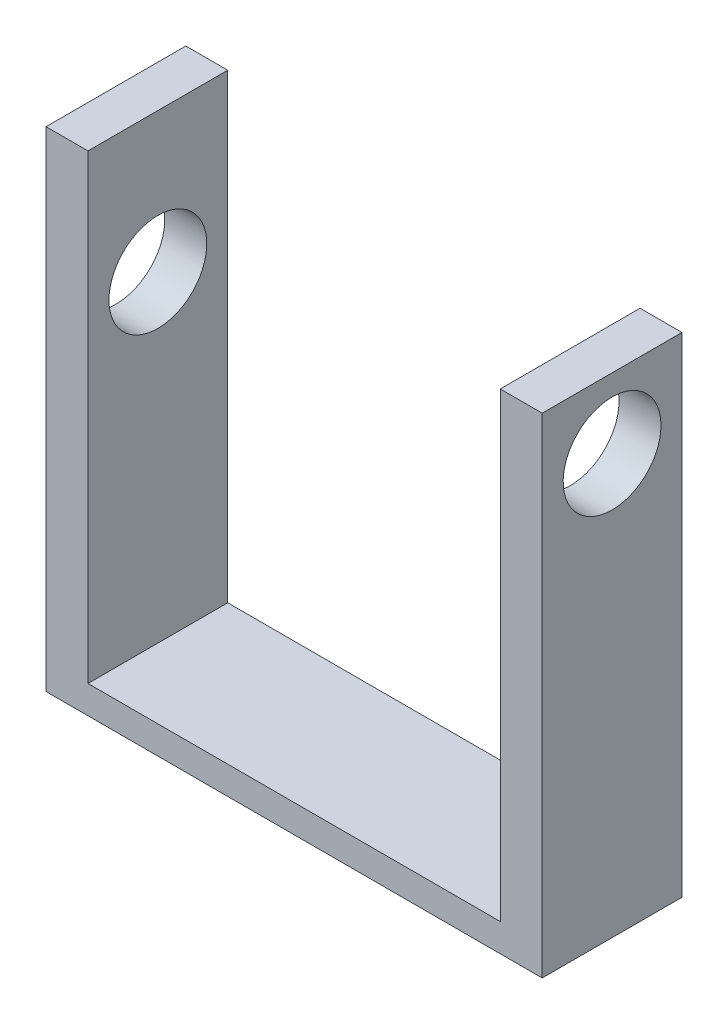
ISO-10303-21;
HEADER;
FILE_DESCRIPTION(('STEP AP214'),'2;1');
FILE_NAME('part.step','',(''),(''),'','','');
FILE_SCHEMA(('AUTOMOTIVE_DESIGN { 1 0 10303 214 1 1 1 1 }'));
ENDSEC;
DATA;
#1=APPLICATION_CONTEXT('core data for automotive mechanical design processes');
#2=APPLICATION_PROTOCOL_DEFINITION('international standard','automotive_design',2000,#1);
#3=PRODUCT_CONTEXT('',#1,'mechanical');
#4=PRODUCT('Part','Part','',(#3));
#5=PRODUCT_RELATED_PRODUCT_CATEGORY('part','',(#4));
#6=PRODUCT_DEFINITION_FORMATION('','',#4);
#7=PRODUCT_DEFINITION_CONTEXT('part definition',#1,'design');
#8=PRODUCT_DEFINITION('design','',#6,#7);
#9=PRODUCT_DEFINITION_SHAPE('','',#8);
#10=(LENGTH_UNIT() NAMED_UNIT(*) SI_UNIT(.MILLI.,.METRE.));
#11=(NAMED_UNIT(*) PLANE_ANGLE_UNIT() SI_UNIT($,.RADIAN.));
#12=(NAMED_UNIT(*) SI_UNIT($,.STERADIAN.) SOLID_ANGLE_UNIT());
#13=UNCERTAINTY_MEASURE_WITH_UNIT(LENGTH_MEASURE(1.E-05),#10,'distance_accuracy_value','');
#14=(GEOMETRIC_REPRESENTATION_CONTEXT(3) GLOBAL_UNCERTAINTY_ASSIGNED_CONTEXT((#13)) GLOBAL_UNIT_ASSIGNED_CONTEXT((#10,
#11,#12)) REPRESENTATION_CONTEXT('',''));
#15=CARTESIAN_POINT('',(0.,0.,0.));
#16=DIRECTION('',(0.,0.,1.));
#17=DIRECTION('',(1.,0.,0.));
#18=AXIS2_PLACEMENT_3D('',#15,#16,#17);
#19=CARTESIAN_POINT('',(-14.75,35.,5.));
#20=DIRECTION('',(0.,-1.,0.));
#21=DIRECTION('',(0.,0.,-1.));
#22=AXIS2_PLACEMENT_3D('',#19,#20,#21);
#23=PLANE('',#22);
#24=DIRECTION('',(-1.,0.,0.));
#25=VECTOR('',#24,1.);
#26=CARTESIAN_POINT('',(-14.75,35.,-5.));
#27=LINE('',#26,#25);
#28=CARTESIAN_POINT('',(-14.75,35.,-5.));
#29=VERTEX_POINT('',#28);
#30=CARTESIAN_POINT('',(-17.75,35.,-5.));
#31=VERTEX_POINT('',#30);
#32=EDGE_CURVE('E132',#29,#31,#27,.T.);
#33=ORIENTED_EDGE('',*,*,#32,.T.);
#34=DIRECTION('',(0.,0.,-1.));
#35=VECTOR('',#34,1.);
#36=CARTESIAN_POINT('',(-17.75,35.,5.));
#37=LINE('',#36,#35);
#38=CARTESIAN_POINT('',(-17.75,35.,5.));
#39=VERTEX_POINT('',#38);
#40=EDGE_CURVE('E11',#39,#31,#37,.T.);
#41=ORIENTED_EDGE('',*,*,#40,.F.);
#42=DIRECTION('',(-1.,0.,0.));
#43=VECTOR('',#42,1.);
#44=CARTESIAN_POINT('',(-14.75,35.,5.));
#45=LINE('',#44,#43);
#46=CARTESIAN_POINT('',(-14.75,35.,5.));
#47=VERTEX_POINT('',#46);
#48=EDGE_CURVE('E147',#47,#39,#45,.T.);
#49=ORIENTED_EDGE('',*,*,#48,.F.);
#50=DIRECTION('',(0.,0.,-1.));
#51=VECTOR('',#50,1.);
#52=CARTESIAN_POINT('',(-14.75,35.,5.));
#53=LINE('',#52,#51);
#54=EDGE_CURVE('E128',#47,#29,#53,.T.);
#55=ORIENTED_EDGE('',*,*,#54,.T.);
#56=EDGE_LOOP('',(#33,#41,#49,#55));
#57=FACE_BOUND('',#56,.T.);
#58=ADVANCED_FACE('F35',(#57),#23,.F.);
#59=CARTESIAN_POINT('',(-17.75,35.,5.));
#60=DIRECTION('',(1.,0.,0.));
#61=DIRECTION('',(0.,1.,0.));
#62=AXIS2_PLACEMENT_3D('',#59,#60,#61);
#63=PLANE('',#62);
#64=CARTESIAN_POINT('',(-17.75,25.,0.));
#65=DIRECTION('',(-1.,0.,0.));
#66=DIRECTION('',(0.,0.,1.));
#67=AXIS2_PLACEMENT_3D('',#64,#65,#66);
#68=CIRCLE('',#67,3.5);
#69=CARTESIAN_POINT('',(-17.75,25.,3.5));
#70=VERTEX_POINT('',#69);
#71=EDGE_CURVE('E183',#70,#70,#68,.T.);
#72=ORIENTED_EDGE('',*,*,#71,.F.);
#73=EDGE_LOOP('',(#72));
#74=FACE_BOUND('',#73,.T.);
#75=DIRECTION('',(0.,-1.,0.));
#76=VECTOR('',#75,1.);
#77=CARTESIAN_POINT('',(-17.75,35.,-5.));
#78=LINE('',#77,#76);
#79=CARTESIAN_POINT('',(-17.75,0.,-5.));
#80=VERTEX_POINT('',#79);
#81=EDGE_CURVE('E135',#31,#80,#78,.T.);
#82=ORIENTED_EDGE('',*,*,#81,.T.);
#83=DIRECTION('',(0.,0.,-1.));
#84=VECTOR('',#83,1.);
#85=CARTESIAN_POINT('',(-17.75,0.,5.));
#86=LINE('',#85,#84);
#87=CARTESIAN_POINT('',(-17.75,0.,5.));
#88=VERTEX_POINT('',#87);
#89=EDGE_CURVE('E44',#88,#80,#86,.T.);
#90=ORIENTED_EDGE('',*,*,#89,.F.);
#91=DIRECTION('',(0.,-1.,0.));
#92=VECTOR('',#91,1.);
#93=CARTESIAN_POINT('',(-17.75,35.,5.));
#94=LINE('',#93,#92);
#95=EDGE_CURVE('E95',#39,#88,#94,.T.);
#96=ORIENTED_EDGE('',*,*,#95,.F.);
#97=ORIENTED_EDGE('',*,*,#40,.T.);
#98=EDGE_LOOP('',(#82,#90,#96,#97));
#99=FACE_BOUND('',#98,.T.);
#100=ADVANCED_FACE('F208',(#74,#99),#63,.F.);
#101=CARTESIAN_POINT('',(-17.75,0.,5.));
#102=DIRECTION('',(0.,1.,0.));
#103=DIRECTION('',(0.,0.,1.));
#104=AXIS2_PLACEMENT_3D('',#101,#102,#103);
#105=PLANE('',#104);
#106=DIRECTION('',(1.,0.,0.));
#107=VECTOR('',#106,1.);
#108=CARTESIAN_POINT('',(-17.75,0.,-5.));
#109=LINE('',#108,#107);
#110=CARTESIAN_POINT('',(17.75,0.,-5.));
#111=VERTEX_POINT('',#110);
#112=EDGE_CURVE('E138',#80,#111,#109,.T.);
#113=ORIENTED_EDGE('',*,*,#112,.T.);
#114=DIRECTION('',(0.,0.,-1.));
#115=VECTOR('',#114,1.);
#116=CARTESIAN_POINT('',(17.75,0.,5.));
#117=LINE('',#116,#115);
#118=CARTESIAN_POINT('',(17.75,0.,5.));
#119=VERTEX_POINT('',#118);
#120=EDGE_CURVE('E154',#119,#111,#117,.T.);
#121=ORIENTED_EDGE('',*,*,#120,.F.);
#122=DIRECTION('',(1.,0.,0.));
#123=VECTOR('',#122,1.);
#124=CARTESIAN_POINT('',(-17.75,0.,5.));
#125=LINE('',#124,#123);
#126=EDGE_CURVE('E163',#88,#119,#125,.T.);
#127=ORIENTED_EDGE('',*,*,#126,.F.);
#128=ORIENTED_EDGE('',*,*,#89,.T.);
#129=EDGE_LOOP('',(#113,#121,#127,#128));
#130=FACE_BOUND('',#129,.T.);
#131=ADVANCED_FACE('F161',(#130),#105,.F.);
#132=CARTESIAN_POINT('',(17.75,0.,5.));
#133=DIRECTION('',(-1.,0.,0.));
#134=DIRECTION('',(0.,-1.,0.));
#135=AXIS2_PLACEMENT_3D('',#132,#133,#134);
#136=PLANE('',#135);
#137=CARTESIAN_POINT('',(17.75,30.,0.));
#138=DIRECTION('',(-1.,0.,0.));
#139=DIRECTION('',(0.,-1.,0.));
#140=AXIS2_PLACEMENT_3D('',#137,#138,#139);
#141=CIRCLE('',#140,3.5);
#142=CARTESIAN_POINT('',(17.75,26.5,0.));
#143=VERTEX_POINT('',#142);
#144=EDGE_CURVE('E136',#143,#143,#141,.T.);
#145=ORIENTED_EDGE('',*,*,#144,.T.);
#146=EDGE_LOOP('',(#145));
#147=FACE_BOUND('',#146,.T.);
#148=DIRECTION('',(0.,1.,0.));
#149=VECTOR('',#148,1.);
#150=CARTESIAN_POINT('',(17.75,0.,-5.));
#151=LINE('',#150,#149);
#152=CARTESIAN_POINT('',(17.75,35.,-5.));
#153=VERTEX_POINT('',#152);
#154=EDGE_CURVE('E140',#111,#153,#151,.T.);
#155=ORIENTED_EDGE('',*,*,#154,.T.);
#156=DIRECTION('',(0.,0.,-1.));
#157=VECTOR('',#156,1.);
#158=CARTESIAN_POINT('',(17.75,35.,5.));
#159=LINE('',#158,#157);
#160=CARTESIAN_POINT('',(17.75,35.,5.));
#161=VERTEX_POINT('',#160);
#162=EDGE_CURVE('E151',#161,#153,#159,.T.);
#163=ORIENTED_EDGE('',*,*,#162,.F.);
#164=DIRECTION('',(0.,1.,0.));
#165=VECTOR('',#164,1.);
#166=CARTESIAN_POINT('',(17.75,0.,5.));
#167=LINE('',#166,#165);
#168=EDGE_CURVE('E175',#119,#161,#167,.T.);
#169=ORIENTED_EDGE('',*,*,#168,.F.);
#170=ORIENTED_EDGE('',*,*,#120,.T.);
#171=EDGE_LOOP('',(#155,#163,#169,#170));
#172=FACE_BOUND('',#171,.T.);
#173=ADVANCED_FACE('F171',(#147,#172),#136,.F.);
#174=CARTESIAN_POINT('',(17.75,35.,5.));
#175=DIRECTION('',(0.,-1.,0.));
#176=DIRECTION('',(0.,0.,-1.));
#177=AXIS2_PLACEMENT_3D('',#174,#175,#176);
#178=PLANE('',#177);
#179=DIRECTION('',(-1.,0.,0.));
#180=VECTOR('',#179,1.);
#181=CARTESIAN_POINT('',(17.75,35.,-5.));
#182=LINE('',#181,#180);
#183=CARTESIAN_POINT('',(14.75,35.,-5.));
#184=VERTEX_POINT('',#183);
#185=EDGE_CURVE('E142',#153,#184,#182,.T.);
#186=ORIENTED_EDGE('',*,*,#185,.T.);
#187=DIRECTION('',(0.,0.,-1.));
#188=VECTOR('',#187,1.);
#189=CARTESIAN_POINT('',(14.75,35.,5.));
#190=LINE('',#189,#188);
#191=CARTESIAN_POINT('',(14.75,35.,5.));
#192=VERTEX_POINT('',#191);
#193=EDGE_CURVE('E123',#192,#184,#190,.T.);
#194=ORIENTED_EDGE('',*,*,#193,.F.);
#195=DIRECTION('',(-1.,0.,0.));
#196=VECTOR('',#195,1.);
#197=CARTESIAN_POINT('',(17.75,35.,5.));
#198=LINE('',#197,#196);
#199=EDGE_CURVE('E114',#161,#192,#198,.T.);
#200=ORIENTED_EDGE('',*,*,#199,.F.);
#201=ORIENTED_EDGE('',*,*,#162,.T.);
#202=EDGE_LOOP('',(#186,#194,#200,#201));
#203=FACE_BOUND('',#202,.T.);
#204=ADVANCED_FACE('F174',(#203),#178,.F.);
#205=CARTESIAN_POINT('',(14.75,35.,5.));
#206=DIRECTION('',(1.,0.,0.));
#207=DIRECTION('',(0.,0.,-1.));
#208=AXIS2_PLACEMENT_3D('',#205,#206,#207);
#209=PLANE('',#208);
#210=CARTESIAN_POINT('',(14.75,30.,0.));
#211=DIRECTION('',(1.,0.,0.));
#212=DIRECTION('',(0.,0.,-1.));
#213=AXIS2_PLACEMENT_3D('',#210,#211,#212);
#214=CIRCLE('',#213,3.5);
#215=CARTESIAN_POINT('',(14.75,30.,-3.5));
#216=VERTEX_POINT('',#215);
#217=EDGE_CURVE('E38',#216,#216,#214,.T.);
#218=ORIENTED_EDGE('',*,*,#217,.T.);
#219=EDGE_LOOP('',(#218));
#220=FACE_BOUND('',#219,.T.);
#221=DIRECTION('',(0.,-1.,0.));
#222=VECTOR('',#221,1.);
#223=CARTESIAN_POINT('',(14.75,35.,-5.));
#224=LINE('',#223,#222);
#225=CARTESIAN_POINT('',(14.75,2.,-5.));
#226=VERTEX_POINT('',#225);
#227=EDGE_CURVE('E122',#184,#226,#224,.T.);
#228=ORIENTED_EDGE('',*,*,#227,.T.);
#229=DIRECTION('',(0.,0.,-1.));
#230=VECTOR('',#229,1.);
#231=CARTESIAN_POINT('',(14.75,2.,5.));
#232=LINE('',#231,#230);
#233=CARTESIAN_POINT('',(14.75,2.,5.));
#234=VERTEX_POINT('',#233);
#235=EDGE_CURVE('E119',#234,#226,#232,.T.);
#236=ORIENTED_EDGE('',*,*,#235,.F.);
#237=DIRECTION('',(0.,-1.,0.));
#238=VECTOR('',#237,1.);
#239=CARTESIAN_POINT('',(14.75,35.,5.));
#240=LINE('',#239,#238);
#241=EDGE_CURVE('E108',#192,#234,#240,.T.);
#242=ORIENTED_EDGE('',*,*,#241,.F.);
#243=ORIENTED_EDGE('',*,*,#193,.T.);
#244=EDGE_LOOP('',(#228,#236,#242,#243));
#245=FACE_BOUND('',#244,.T.);
#246=ADVANCED_FACE('F120',(#220,#245),#209,.F.);
#247=CARTESIAN_POINT('',(14.75,2.,5.));
#248=DIRECTION('',(0.,-1.,0.));
#249=DIRECTION('',(0.,0.,-1.));
#250=AXIS2_PLACEMENT_3D('',#247,#248,#249);
#251=PLANE('',#250);
#252=DIRECTION('',(-1.,0.,0.));
#253=VECTOR('',#252,1.);
#254=CARTESIAN_POINT('',(14.75,2.,-5.));
#255=LINE('',#254,#253);
#256=CARTESIAN_POINT('',(-14.75,2.,-5.));
#257=VERTEX_POINT('',#256);
#258=EDGE_CURVE('E81',#226,#257,#255,.T.);
#259=ORIENTED_EDGE('',*,*,#258,.T.);
#260=DIRECTION('',(0.,0.,-1.));
#261=VECTOR('',#260,1.);
#262=CARTESIAN_POINT('',(-14.75,2.,5.));
#263=LINE('',#262,#261);
#264=CARTESIAN_POINT('',(-14.75,2.,5.));
#265=VERTEX_POINT('',#264);
#266=EDGE_CURVE('E124',#265,#257,#263,.T.);
#267=ORIENTED_EDGE('',*,*,#266,.F.);
#268=DIRECTION('',(-1.,0.,0.));
#269=VECTOR('',#268,1.);
#270=CARTESIAN_POINT('',(14.75,2.,5.));
#271=LINE('',#270,#269);
#272=EDGE_CURVE('E112',#234,#265,#271,.T.);
#273=ORIENTED_EDGE('',*,*,#272,.F.);
#274=ORIENTED_EDGE('',*,*,#235,.T.);
#275=EDGE_LOOP('',(#259,#267,#273,#274));
#276=FACE_BOUND('',#275,.T.);
#277=ADVANCED_FACE('F126',(#276),#251,.F.);
#278=CARTESIAN_POINT('',(-14.75,2.,5.));
#279=DIRECTION('',(-1.,0.,0.));
#280=DIRECTION('',(0.,0.,1.));
#281=AXIS2_PLACEMENT_3D('',#278,#279,#280);
#282=PLANE('',#281);
#283=CARTESIAN_POINT('',(-14.75,25.,0.));
#284=DIRECTION('',(-1.,0.,0.));
#285=DIRECTION('',(0.,0.,1.));
#286=AXIS2_PLACEMENT_3D('',#283,#284,#285);
#287=CIRCLE('',#286,3.5);
#288=CARTESIAN_POINT('',(-14.75,25.,3.5));
#289=VERTEX_POINT('',#288);
#290=EDGE_CURVE('E186',#289,#289,#287,.F.);
#291=ORIENTED_EDGE('',*,*,#290,.F.);
#292=EDGE_LOOP('',(#291));
#293=FACE_BOUND('',#292,.T.);
#294=DIRECTION('',(0.,1.,0.));
#295=VECTOR('',#294,1.);
#296=CARTESIAN_POINT('',(-14.75,2.,-5.));
#297=LINE('',#296,#295);
#298=EDGE_CURVE('E87',#257,#29,#297,.T.);
#299=ORIENTED_EDGE('',*,*,#298,.T.);
#300=ORIENTED_EDGE('',*,*,#54,.F.);
#301=DIRECTION('',(0.,1.,0.));
#302=VECTOR('',#301,1.);
#303=CARTESIAN_POINT('',(-14.75,2.,5.));
#304=LINE('',#303,#302);
#305=EDGE_CURVE('E52',#265,#47,#304,.T.);
#306=ORIENTED_EDGE('',*,*,#305,.F.);
#307=ORIENTED_EDGE('',*,*,#266,.T.);
#308=EDGE_LOOP('',(#299,#300,#306,#307));
#309=FACE_BOUND('',#308,.T.);
#310=ADVANCED_FACE('F218',(#293,#309),#282,.F.);
#311=CARTESIAN_POINT('',(0.,0.,5.));
#312=DIRECTION('',(0.,0.,1.));
#313=DIRECTION('',(1.,0.,0.));
#314=AXIS2_PLACEMENT_3D('',#311,#312,#313);
#315=PLANE('',#314);
#316=ORIENTED_EDGE('',*,*,#48,.T.);
#317=ORIENTED_EDGE('',*,*,#95,.T.);
#318=ORIENTED_EDGE('',*,*,#126,.T.);
#319=ORIENTED_EDGE('',*,*,#168,.T.);
#320=ORIENTED_EDGE('',*,*,#199,.T.);
#321=ORIENTED_EDGE('',*,*,#241,.T.);
#322=ORIENTED_EDGE('',*,*,#272,.T.);
#323=ORIENTED_EDGE('',*,*,#305,.T.);
#324=EDGE_LOOP('',(#316,#317,#318,#319,#320,#321,#322,#323));
#325=FACE_BOUND('',#324,.T.);
#326=ADVANCED_FACE('F110',(#325),#315,.T.);
#327=CARTESIAN_POINT('',(0.,0.,-5.));
#328=DIRECTION('',(0.,0.,1.));
#329=DIRECTION('',(1.,0.,0.));
#330=AXIS2_PLACEMENT_3D('',#327,#328,#329);
#331=PLANE('',#330);
#332=ORIENTED_EDGE('',*,*,#32,.F.);
#333=ORIENTED_EDGE('',*,*,#298,.F.);
#334=ORIENTED_EDGE('',*,*,#258,.F.);
#335=ORIENTED_EDGE('',*,*,#227,.F.);
#336=ORIENTED_EDGE('',*,*,#185,.F.);
#337=ORIENTED_EDGE('',*,*,#154,.F.);
#338=ORIENTED_EDGE('',*,*,#112,.F.);
#339=ORIENTED_EDGE('',*,*,#81,.F.);
#340=EDGE_LOOP('',(#332,#333,#334,#335,#336,#337,#338,#339));
#341=FACE_BOUND('',#340,.T.);
#342=ADVANCED_FACE('F167',(#341),#331,.F.);
#343=CARTESIAN_POINT('',(12.75,30.,0.));
#344=DIRECTION('',(1.,0.,0.));
#345=DIRECTION('',(0.,0.,-1.));
#346=AXIS2_PLACEMENT_3D('',#343,#344,#345);
#347=CYLINDRICAL_SURFACE('',#346,3.5);
#348=ORIENTED_EDGE('',*,*,#217,.F.);
#349=EDGE_LOOP('',(#348));
#350=FACE_BOUND('',#349,.T.);
#351=ORIENTED_EDGE('',*,*,#144,.F.);
#352=EDGE_LOOP('',(#351));
#353=FACE_BOUND('',#352,.T.);
#354=ADVANCED_FACE('F194',(#350,#353),#347,.F.);
#355=CARTESIAN_POINT('',(17.751,25.,0.));
#356=DIRECTION('',(-1.,0.,0.));
#357=DIRECTION('',(0.,0.,1.));
#358=AXIS2_PLACEMENT_3D('',#355,#356,#357);
#359=CYLINDRICAL_SURFACE('',#358,3.5);
#360=ORIENTED_EDGE('',*,*,#71,.T.);
#361=EDGE_LOOP('',(#360));
#362=FACE_BOUND('',#361,.T.);
#363=ORIENTED_EDGE('',*,*,#290,.T.);
#364=EDGE_LOOP('',(#363));
#365=FACE_BOUND('',#364,.T.);
#366=ADVANCED_FACE('F197',(#362,#365),#359,.F.);
#367=CLOSED_SHELL('',(#58,#100,#131,#173,#204,#246,#277,#310,#326,#342,#354,#366));
#368=MANIFOLD_SOLID_BREP('B2',#367);
#369=ADVANCED_BREP_SHAPE_REPRESENTATION('',(#18,#368),#14);
#370=SHAPE_DEFINITION_REPRESENTATION(#9,#369);
ENDSEC;
END-ISO-10303-21;
